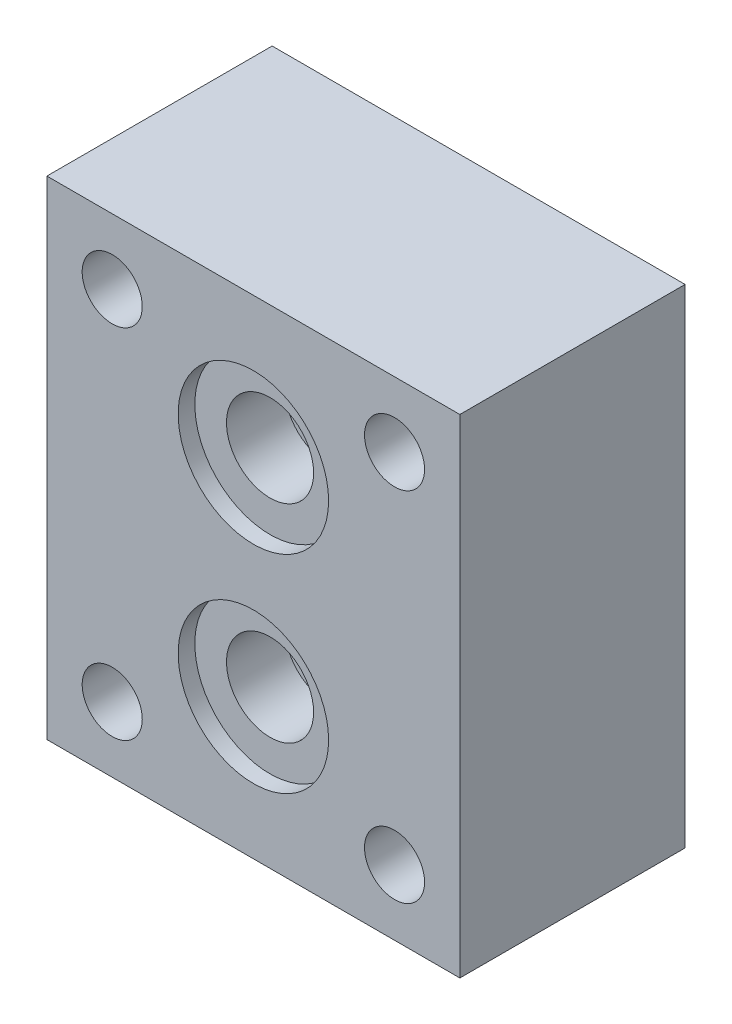
ISO-10303-21;
HEADER;
FILE_DESCRIPTION(('STEP AP214'),'2;1');
FILE_NAME('part.step','',(''),(''),'','','');
FILE_SCHEMA(('AUTOMOTIVE_DESIGN { 1 0 10303 214 1 1 1 1 }'));
ENDSEC;
DATA;
#1=APPLICATION_CONTEXT('core data for automotive mechanical design processes');
#2=APPLICATION_PROTOCOL_DEFINITION('international standard','automotive_design',2000,#1);
#3=PRODUCT_CONTEXT('',#1,'mechanical');
#4=PRODUCT('Part','Part','',(#3));
#5=PRODUCT_RELATED_PRODUCT_CATEGORY('part','',(#4));
#6=PRODUCT_DEFINITION_FORMATION('','',#4);
#7=PRODUCT_DEFINITION_CONTEXT('part definition',#1,'design');
#8=PRODUCT_DEFINITION('design','',#6,#7);
#9=PRODUCT_DEFINITION_SHAPE('','',#8);
#10=(LENGTH_UNIT() NAMED_UNIT(*) SI_UNIT(.MILLI.,.METRE.));
#11=(NAMED_UNIT(*) PLANE_ANGLE_UNIT() SI_UNIT($,.RADIAN.));
#12=(NAMED_UNIT(*) SI_UNIT($,.STERADIAN.) SOLID_ANGLE_UNIT());
#13=UNCERTAINTY_MEASURE_WITH_UNIT(LENGTH_MEASURE(1.E-05),#10,'distance_accuracy_value','');
#14=(GEOMETRIC_REPRESENTATION_CONTEXT(3) GLOBAL_UNCERTAINTY_ASSIGNED_CONTEXT((#13)) GLOBAL_UNIT_ASSIGNED_CONTEXT((#10,
#11,#12)) REPRESENTATION_CONTEXT('',''));
#15=CARTESIAN_POINT('',(0.,0.,0.));
#16=DIRECTION('',(0.,0.,1.));
#17=DIRECTION('',(1.,0.,0.));
#18=AXIS2_PLACEMENT_3D('',#15,#16,#17);
#19=CARTESIAN_POINT('',(34.925,41.275,19.05));
#20=DIRECTION('',(0.,-1.,0.));
#21=DIRECTION('',(0.,0.,-1.));
#22=AXIS2_PLACEMENT_3D('',#19,#20,#21);
#23=PLANE('',#22);
#24=DIRECTION('',(-1.,0.,0.));
#25=VECTOR('',#24,1.);
#26=CARTESIAN_POINT('',(34.925,41.275,-19.05));
#27=LINE('',#26,#25);
#28=CARTESIAN_POINT('',(34.925,41.275,-19.05));
#29=VERTEX_POINT('',#28);
#30=CARTESIAN_POINT('',(-34.925,41.275,-19.05));
#31=VERTEX_POINT('',#30);
#32=EDGE_CURVE('E109',#29,#31,#27,.T.);
#33=ORIENTED_EDGE('',*,*,#32,.T.);
#34=DIRECTION('',(0.,0.,-1.));
#35=VECTOR('',#34,1.);
#36=CARTESIAN_POINT('',(-34.925,41.275,19.05));
#37=LINE('',#36,#35);
#38=CARTESIAN_POINT('',(-34.925,41.275,19.05));
#39=VERTEX_POINT('',#38);
#40=EDGE_CURVE('E11',#39,#31,#37,.T.);
#41=ORIENTED_EDGE('',*,*,#40,.F.);
#42=DIRECTION('',(-1.,0.,0.));
#43=VECTOR('',#42,1.);
#44=CARTESIAN_POINT('',(34.925,41.275,19.05));
#45=LINE('',#44,#43);
#46=CARTESIAN_POINT('',(34.925,41.275,19.05));
#47=VERTEX_POINT('',#46);
#48=EDGE_CURVE('E96',#47,#39,#45,.T.);
#49=ORIENTED_EDGE('',*,*,#48,.F.);
#50=DIRECTION('',(0.,0.,-1.));
#51=VECTOR('',#50,1.);
#52=CARTESIAN_POINT('',(34.925,41.275,19.05));
#53=LINE('',#52,#51);
#54=EDGE_CURVE('E105',#47,#29,#53,.T.);
#55=ORIENTED_EDGE('',*,*,#54,.T.);
#56=EDGE_LOOP('',(#33,#41,#49,#55));
#57=FACE_BOUND('',#56,.T.);
#58=ADVANCED_FACE('F43',(#57),#23,.F.);
#59=CARTESIAN_POINT('',(-34.925,-41.275,19.05));
#60=DIRECTION('',(1.,0.,0.));
#61=DIRECTION('',(0.,0.,-1.));
#62=AXIS2_PLACEMENT_3D('',#59,#60,#61);
#63=PLANE('',#62);
#64=DIRECTION('',(0.,-1.,0.));
#65=VECTOR('',#64,1.);
#66=CARTESIAN_POINT('',(-34.925,-41.275,-19.05));
#67=LINE('',#66,#65);
#68=CARTESIAN_POINT('',(-34.925,-41.275,-19.05));
#69=VERTEX_POINT('',#68);
#70=EDGE_CURVE('E100',#31,#69,#67,.T.);
#71=ORIENTED_EDGE('',*,*,#70,.T.);
#72=DIRECTION('',(0.,0.,-1.));
#73=VECTOR('',#72,1.);
#74=CARTESIAN_POINT('',(-34.925,-41.275,19.05));
#75=LINE('',#74,#73);
#76=CARTESIAN_POINT('',(-34.925,-41.275,19.05));
#77=VERTEX_POINT('',#76);
#78=EDGE_CURVE('E52',#77,#69,#75,.T.);
#79=ORIENTED_EDGE('',*,*,#78,.F.);
#80=DIRECTION('',(0.,-1.,0.));
#81=VECTOR('',#80,1.);
#82=CARTESIAN_POINT('',(-34.925,-41.275,19.05));
#83=LINE('',#82,#81);
#84=EDGE_CURVE('E91',#39,#77,#83,.T.);
#85=ORIENTED_EDGE('',*,*,#84,.F.);
#86=ORIENTED_EDGE('',*,*,#40,.T.);
#87=EDGE_LOOP('',(#71,#79,#85,#86));
#88=FACE_BOUND('',#87,.T.);
#89=ADVANCED_FACE('F99',(#88),#63,.F.);
#90=CARTESIAN_POINT('',(34.925,-41.275,19.05));
#91=DIRECTION('',(0.,1.,0.));
#92=DIRECTION('',(0.,0.,1.));
#93=AXIS2_PLACEMENT_3D('',#90,#91,#92);
#94=PLANE('',#93);
#95=DIRECTION('',(1.,0.,0.));
#96=VECTOR('',#95,1.);
#97=CARTESIAN_POINT('',(34.925,-41.275,-19.05));
#98=LINE('',#97,#96);
#99=CARTESIAN_POINT('',(34.925,-41.275,-19.05));
#100=VERTEX_POINT('',#99);
#101=EDGE_CURVE('E78',#69,#100,#98,.T.);
#102=ORIENTED_EDGE('',*,*,#101,.T.);
#103=DIRECTION('',(0.,0.,-1.));
#104=VECTOR('',#103,1.);
#105=CARTESIAN_POINT('',(34.925,-41.275,19.05));
#106=LINE('',#105,#104);
#107=CARTESIAN_POINT('',(34.925,-41.275,19.05));
#108=VERTEX_POINT('',#107);
#109=EDGE_CURVE('E101',#108,#100,#106,.T.);
#110=ORIENTED_EDGE('',*,*,#109,.F.);
#111=DIRECTION('',(1.,0.,0.));
#112=VECTOR('',#111,1.);
#113=CARTESIAN_POINT('',(34.925,-41.275,19.05));
#114=LINE('',#113,#112);
#115=EDGE_CURVE('E94',#77,#108,#114,.T.);
#116=ORIENTED_EDGE('',*,*,#115,.F.);
#117=ORIENTED_EDGE('',*,*,#78,.T.);
#118=EDGE_LOOP('',(#102,#110,#116,#117));
#119=FACE_BOUND('',#118,.T.);
#120=ADVANCED_FACE('F103',(#119),#94,.F.);
#121=CARTESIAN_POINT('',(34.925,-41.275,19.05));
#122=DIRECTION('',(-1.,0.,0.));
#123=DIRECTION('',(0.,0.,1.));
#124=AXIS2_PLACEMENT_3D('',#121,#122,#123);
#125=PLANE('',#124);
#126=DIRECTION('',(0.,1.,0.));
#127=VECTOR('',#126,1.);
#128=CARTESIAN_POINT('',(34.925,-41.275,-19.05));
#129=LINE('',#128,#127);
#130=EDGE_CURVE('E84',#100,#29,#129,.T.);
#131=ORIENTED_EDGE('',*,*,#130,.T.);
#132=ORIENTED_EDGE('',*,*,#54,.F.);
#133=DIRECTION('',(0.,1.,0.));
#134=VECTOR('',#133,1.);
#135=CARTESIAN_POINT('',(34.925,-41.275,19.05));
#136=LINE('',#135,#134);
#137=EDGE_CURVE('E61',#108,#47,#136,.T.);
#138=ORIENTED_EDGE('',*,*,#137,.F.);
#139=ORIENTED_EDGE('',*,*,#109,.T.);
#140=EDGE_LOOP('',(#131,#132,#138,#139));
#141=FACE_BOUND('',#140,.T.);
#142=ADVANCED_FACE('F171',(#141),#125,.F.);
#143=CARTESIAN_POINT('',(0.,0.,19.05));
#144=DIRECTION('',(0.,0.,-1.));
#145=DIRECTION('',(-1.,0.,0.));
#146=AXIS2_PLACEMENT_3D('',#143,#144,#145);
#147=PLANE('',#146);
#148=CARTESIAN_POINT('',(0.,-17.526,19.05));
#149=DIRECTION('',(0.,0.,1.));
#150=DIRECTION('',(1.,0.,0.));
#151=AXIS2_PLACEMENT_3D('',#148,#149,#150);
#152=CIRCLE('',#151,12.7254);
#153=CARTESIAN_POINT('',(12.7254,-17.526,19.05));
#154=VERTEX_POINT('',#153);
#155=EDGE_CURVE('E125',#154,#154,#152,.T.);
#156=ORIENTED_EDGE('',*,*,#155,.F.);
#157=EDGE_LOOP('',(#156));
#158=FACE_BOUND('',#157,.T.);
#159=CARTESIAN_POINT('',(0.,17.526,19.05));
#160=DIRECTION('',(0.,0.,1.));
#161=DIRECTION('',(1.,0.,0.));
#162=AXIS2_PLACEMENT_3D('',#159,#160,#161);
#163=CIRCLE('',#162,12.7254);
#164=CARTESIAN_POINT('',(12.7254,17.526,19.05));
#165=VERTEX_POINT('',#164);
#166=EDGE_CURVE('E130',#165,#165,#163,.T.);
#167=ORIENTED_EDGE('',*,*,#166,.F.);
#168=EDGE_LOOP('',(#167));
#169=FACE_BOUND('',#168,.T.);
#170=CARTESIAN_POINT('',(23.876,30.226,19.05));
#171=DIRECTION('',(0.,0.,1.));
#172=DIRECTION('',(1.,0.,0.));
#173=AXIS2_PLACEMENT_3D('',#170,#171,#172);
#174=CIRCLE('',#173,5.08);
#175=CARTESIAN_POINT('',(28.956,30.226,19.05));
#176=VERTEX_POINT('',#175);
#177=EDGE_CURVE('E150',#176,#176,#174,.T.);
#178=ORIENTED_EDGE('',*,*,#177,.F.);
#179=EDGE_LOOP('',(#178));
#180=FACE_BOUND('',#179,.T.);
#181=CARTESIAN_POINT('',(-23.876,-30.226,19.05));
#182=DIRECTION('',(0.,0.,1.));
#183=DIRECTION('',(1.,0.,0.));
#184=AXIS2_PLACEMENT_3D('',#181,#182,#183);
#185=CIRCLE('',#184,5.08);
#186=CARTESIAN_POINT('',(-18.796,-30.226,19.05));
#187=VERTEX_POINT('',#186);
#188=EDGE_CURVE('E157',#187,#187,#185,.T.);
#189=ORIENTED_EDGE('',*,*,#188,.F.);
#190=EDGE_LOOP('',(#189));
#191=FACE_BOUND('',#190,.T.);
#192=CARTESIAN_POINT('',(-23.876,30.226,19.05));
#193=DIRECTION('',(0.,0.,1.));
#194=DIRECTION('',(1.,0.,0.));
#195=AXIS2_PLACEMENT_3D('',#192,#193,#194);
#196=CIRCLE('',#195,5.08);
#197=CARTESIAN_POINT('',(-18.796,30.226,19.05));
#198=VERTEX_POINT('',#197);
#199=EDGE_CURVE('E144',#198,#198,#196,.T.);
#200=ORIENTED_EDGE('',*,*,#199,.F.);
#201=EDGE_LOOP('',(#200));
#202=FACE_BOUND('',#201,.T.);
#203=CARTESIAN_POINT('',(23.876,-30.226,19.05));
#204=DIRECTION('',(0.,0.,1.));
#205=DIRECTION('',(1.,0.,0.));
#206=AXIS2_PLACEMENT_3D('',#203,#204,#205);
#207=CIRCLE('',#206,5.08);
#208=CARTESIAN_POINT('',(28.956,-30.226,19.05));
#209=VERTEX_POINT('',#208);
#210=EDGE_CURVE('E153',#209,#209,#207,.T.);
#211=ORIENTED_EDGE('',*,*,#210,.F.);
#212=EDGE_LOOP('',(#211));
#213=FACE_BOUND('',#212,.T.);
#214=ORIENTED_EDGE('',*,*,#48,.T.);
#215=ORIENTED_EDGE('',*,*,#84,.T.);
#216=ORIENTED_EDGE('',*,*,#115,.T.);
#217=ORIENTED_EDGE('',*,*,#137,.T.);
#218=EDGE_LOOP('',(#214,#215,#216,#217));
#219=FACE_BOUND('',#218,.T.);
#220=ADVANCED_FACE('F92',(#158,#169,#180,#191,#202,#213,#219),#147,.F.);
#221=CARTESIAN_POINT('',(0.,0.,-19.05));
#222=DIRECTION('',(0.,0.,-1.));
#223=DIRECTION('',(-1.,0.,0.));
#224=AXIS2_PLACEMENT_3D('',#221,#222,#223);
#225=PLANE('',#224);
#226=CARTESIAN_POINT('',(23.876,30.226,-19.05));
#227=DIRECTION('',(0.,0.,1.));
#228=DIRECTION('',(1.,0.,0.));
#229=AXIS2_PLACEMENT_3D('',#226,#227,#228);
#230=CIRCLE('',#229,5.08);
#231=CARTESIAN_POINT('',(28.956,30.226,-19.05));
#232=VERTEX_POINT('',#231);
#233=EDGE_CURVE('E154',#232,#232,#230,.T.);
#234=ORIENTED_EDGE('',*,*,#233,.T.);
#235=EDGE_LOOP('',(#234));
#236=FACE_BOUND('',#235,.T.);
#237=CARTESIAN_POINT('',(-23.876,-30.226,-19.05));
#238=DIRECTION('',(0.,0.,1.));
#239=DIRECTION('',(1.,0.,0.));
#240=AXIS2_PLACEMENT_3D('',#237,#238,#239);
#241=CIRCLE('',#240,5.08);
#242=CARTESIAN_POINT('',(-18.796,-30.226,-19.05));
#243=VERTEX_POINT('',#242);
#244=EDGE_CURVE('E147',#243,#243,#241,.T.);
#245=ORIENTED_EDGE('',*,*,#244,.T.);
#246=EDGE_LOOP('',(#245));
#247=FACE_BOUND('',#246,.T.);
#248=CARTESIAN_POINT('',(-23.876,30.226,-19.05));
#249=DIRECTION('',(0.,0.,1.));
#250=DIRECTION('',(1.,0.,0.));
#251=AXIS2_PLACEMENT_3D('',#248,#249,#250);
#252=CIRCLE('',#251,5.08);
#253=CARTESIAN_POINT('',(-18.796,30.226,-19.05));
#254=VERTEX_POINT('',#253);
#255=EDGE_CURVE('E141',#254,#254,#252,.T.);
#256=ORIENTED_EDGE('',*,*,#255,.T.);
#257=EDGE_LOOP('',(#256));
#258=FACE_BOUND('',#257,.T.);
#259=CARTESIAN_POINT('',(23.876,-30.226,-19.05));
#260=DIRECTION('',(0.,0.,1.));
#261=DIRECTION('',(1.,0.,0.));
#262=AXIS2_PLACEMENT_3D('',#259,#260,#261);
#263=CIRCLE('',#262,5.08);
#264=CARTESIAN_POINT('',(28.956,-30.226,-19.05));
#265=VERTEX_POINT('',#264);
#266=EDGE_CURVE('E112',#265,#265,#263,.T.);
#267=ORIENTED_EDGE('',*,*,#266,.T.);
#268=EDGE_LOOP('',(#267));
#269=FACE_BOUND('',#268,.T.);
#270=ORIENTED_EDGE('',*,*,#32,.F.);
#271=ORIENTED_EDGE('',*,*,#130,.F.);
#272=ORIENTED_EDGE('',*,*,#101,.F.);
#273=ORIENTED_EDGE('',*,*,#70,.F.);
#274=EDGE_LOOP('',(#270,#271,#272,#273));
#275=FACE_BOUND('',#274,.T.);
#276=ADVANCED_FACE('F170',(#236,#247,#258,#269,#275),#225,.T.);
#277=CARTESIAN_POINT('',(23.876,-30.226,-19.05));
#278=DIRECTION('',(0.,0.,1.));
#279=DIRECTION('',(1.,0.,0.));
#280=AXIS2_PLACEMENT_3D('',#277,#278,#279);
#281=CYLINDRICAL_SURFACE('',#280,5.08);
#282=ORIENTED_EDGE('',*,*,#266,.F.);
#283=EDGE_LOOP('',(#282));
#284=FACE_BOUND('',#283,.T.);
#285=ORIENTED_EDGE('',*,*,#210,.T.);
#286=EDGE_LOOP('',(#285));
#287=FACE_BOUND('',#286,.T.);
#288=ADVANCED_FACE('F167',(#284,#287),#281,.F.);
#289=CARTESIAN_POINT('',(-23.876,30.226,-19.05));
#290=DIRECTION('',(0.,0.,1.));
#291=DIRECTION('',(1.,0.,0.));
#292=AXIS2_PLACEMENT_3D('',#289,#290,#291);
#293=CYLINDRICAL_SURFACE('',#292,5.08);
#294=ORIENTED_EDGE('',*,*,#255,.F.);
#295=EDGE_LOOP('',(#294));
#296=FACE_BOUND('',#295,.T.);
#297=ORIENTED_EDGE('',*,*,#199,.T.);
#298=EDGE_LOOP('',(#297));
#299=FACE_BOUND('',#298,.T.);
#300=ADVANCED_FACE('F216',(#296,#299),#293,.F.);
#301=CARTESIAN_POINT('',(-23.876,-30.226,-19.05));
#302=DIRECTION('',(0.,0.,1.));
#303=DIRECTION('',(1.,0.,0.));
#304=AXIS2_PLACEMENT_3D('',#301,#302,#303);
#305=CYLINDRICAL_SURFACE('',#304,5.08);
#306=ORIENTED_EDGE('',*,*,#244,.F.);
#307=EDGE_LOOP('',(#306));
#308=FACE_BOUND('',#307,.T.);
#309=ORIENTED_EDGE('',*,*,#188,.T.);
#310=EDGE_LOOP('',(#309));
#311=FACE_BOUND('',#310,.T.);
#312=ADVANCED_FACE('F224',(#308,#311),#305,.F.);
#313=CARTESIAN_POINT('',(23.876,30.226,-19.05));
#314=DIRECTION('',(0.,0.,1.));
#315=DIRECTION('',(1.,0.,0.));
#316=AXIS2_PLACEMENT_3D('',#313,#314,#315);
#317=CYLINDRICAL_SURFACE('',#316,5.08);
#318=ORIENTED_EDGE('',*,*,#233,.F.);
#319=EDGE_LOOP('',(#318));
#320=FACE_BOUND('',#319,.T.);
#321=ORIENTED_EDGE('',*,*,#177,.T.);
#322=EDGE_LOOP('',(#321));
#323=FACE_BOUND('',#322,.T.);
#324=ADVANCED_FACE('F233',(#320,#323),#317,.F.);
#325=CARTESIAN_POINT('',(0.,-17.526,16.2306));
#326=DIRECTION('',(0.,0.,1.));
#327=DIRECTION('',(1.,0.,0.));
#328=AXIS2_PLACEMENT_3D('',#325,#326,#327);
#329=PLANE('',#328);
#330=CARTESIAN_POINT('',(0.,-17.526,16.2306));
#331=DIRECTION('',(0.,0.,1.));
#332=DIRECTION('',(1.,0.,0.));
#333=AXIS2_PLACEMENT_3D('',#330,#331,#332);
#334=CIRCLE('',#333,12.7254);
#335=CARTESIAN_POINT('',(12.7254,-17.526,16.2306));
#336=VERTEX_POINT('',#335);
#337=EDGE_CURVE('E119',#336,#336,#334,.T.);
#338=ORIENTED_EDGE('',*,*,#337,.T.);
#339=EDGE_LOOP('',(#338));
#340=FACE_BOUND('',#339,.T.);
#341=CARTESIAN_POINT('',(0.,-17.526,16.2306));
#342=DIRECTION('',(0.,0.,1.));
#343=DIRECTION('',(1.,0.,0.));
#344=AXIS2_PLACEMENT_3D('',#341,#342,#343);
#345=CIRCLE('',#344,7.366);
#346=CARTESIAN_POINT('',(7.366,-17.526,16.2306));
#347=VERTEX_POINT('',#346);
#348=EDGE_CURVE('E117',#347,#347,#345,.F.);
#349=ORIENTED_EDGE('',*,*,#348,.T.);
#350=EDGE_LOOP('',(#349));
#351=FACE_BOUND('',#350,.T.);
#352=ADVANCED_FACE('F242',(#340,#351),#329,.T.);
#353=CARTESIAN_POINT('',(0.,-17.526,16.2306));
#354=DIRECTION('',(0.,0.,1.));
#355=DIRECTION('',(1.,0.,0.));
#356=AXIS2_PLACEMENT_3D('',#353,#354,#355);
#357=CYLINDRICAL_SURFACE('',#356,12.7254);
#358=ORIENTED_EDGE('',*,*,#337,.F.);
#359=EDGE_LOOP('',(#358));
#360=FACE_BOUND('',#359,.T.);
#361=ORIENTED_EDGE('',*,*,#155,.T.);
#362=EDGE_LOOP('',(#361));
#363=FACE_BOUND('',#362,.T.);
#364=ADVANCED_FACE('F289',(#360,#363),#357,.F.);
#365=CARTESIAN_POINT('',(0.,17.526,16.2306));
#366=DIRECTION('',(0.,0.,1.));
#367=DIRECTION('',(1.,0.,0.));
#368=AXIS2_PLACEMENT_3D('',#365,#366,#367);
#369=PLANE('',#368);
#370=CARTESIAN_POINT('',(0.,17.526,16.2306));
#371=DIRECTION('',(0.,0.,1.));
#372=DIRECTION('',(1.,0.,0.));
#373=AXIS2_PLACEMENT_3D('',#370,#371,#372);
#374=CIRCLE('',#373,12.7254);
#375=CARTESIAN_POINT('',(12.7254,17.526,16.2306));
#376=VERTEX_POINT('',#375);
#377=EDGE_CURVE('E135',#376,#376,#374,.T.);
#378=ORIENTED_EDGE('',*,*,#377,.T.);
#379=EDGE_LOOP('',(#378));
#380=FACE_BOUND('',#379,.T.);
#381=CARTESIAN_POINT('',(0.,17.526,16.2306));
#382=DIRECTION('',(0.,0.,1.));
#383=DIRECTION('',(1.,0.,0.));
#384=AXIS2_PLACEMENT_3D('',#381,#382,#383);
#385=CIRCLE('',#384,7.366);
#386=CARTESIAN_POINT('',(7.366,17.526,16.2306));
#387=VERTEX_POINT('',#386);
#388=EDGE_CURVE('E46',#387,#387,#385,.F.);
#389=ORIENTED_EDGE('',*,*,#388,.T.);
#390=EDGE_LOOP('',(#389));
#391=FACE_BOUND('',#390,.T.);
#392=ADVANCED_FACE('F298',(#380,#391),#369,.T.);
#393=CARTESIAN_POINT('',(0.,17.526,16.2306));
#394=DIRECTION('',(0.,0.,1.));
#395=DIRECTION('',(1.,0.,0.));
#396=AXIS2_PLACEMENT_3D('',#393,#394,#395);
#397=CYLINDRICAL_SURFACE('',#396,12.7254);
#398=ORIENTED_EDGE('',*,*,#377,.F.);
#399=EDGE_LOOP('',(#398));
#400=FACE_BOUND('',#399,.T.);
#401=ORIENTED_EDGE('',*,*,#166,.T.);
#402=EDGE_LOOP('',(#401));
#403=FACE_BOUND('',#402,.T.);
#404=ADVANCED_FACE('F261',(#400,#403),#397,.F.);
#405=CARTESIAN_POINT('',(0.,-17.526,6.35));
#406=DIRECTION('',(0.,0.,1.));
#407=DIRECTION('',(1.,0.,0.));
#408=AXIS2_PLACEMENT_3D('',#405,#406,#407);
#409=PLANE('',#408);
#410=CARTESIAN_POINT('',(0.,-17.526,6.35));
#411=DIRECTION('',(0.,0.,1.));
#412=DIRECTION('',(1.,0.,0.));
#413=AXIS2_PLACEMENT_3D('',#410,#411,#412);
#414=CIRCLE('',#413,7.366);
#415=CARTESIAN_POINT('',(7.366,-17.526,6.35));
#416=VERTEX_POINT('',#415);
#417=EDGE_CURVE('E138',#416,#416,#414,.T.);
#418=ORIENTED_EDGE('',*,*,#417,.T.);
#419=EDGE_LOOP('',(#418));
#420=FACE_BOUND('',#419,.T.);
#421=ADVANCED_FACE('F259',(#420),#409,.T.);
#422=CARTESIAN_POINT('',(0.,-17.526,6.35));
#423=DIRECTION('',(0.,0.,1.));
#424=DIRECTION('',(1.,0.,0.));
#425=AXIS2_PLACEMENT_3D('',#422,#423,#424);
#426=CYLINDRICAL_SURFACE('',#425,7.366);
#427=ORIENTED_EDGE('',*,*,#417,.F.);
#428=EDGE_LOOP('',(#427));
#429=FACE_BOUND('',#428,.T.);
#430=ORIENTED_EDGE('',*,*,#348,.F.);
#431=EDGE_LOOP('',(#430));
#432=FACE_BOUND('',#431,.T.);
#433=ADVANCED_FACE('F252',(#429,#432),#426,.F.);
#434=CARTESIAN_POINT('',(0.,17.526,6.35));
#435=DIRECTION('',(0.,0.,1.));
#436=DIRECTION('',(1.,0.,0.));
#437=AXIS2_PLACEMENT_3D('',#434,#435,#436);
#438=PLANE('',#437);
#439=CARTESIAN_POINT('',(0.,17.526,6.35));
#440=DIRECTION('',(0.,0.,1.));
#441=DIRECTION('',(1.,0.,0.));
#442=AXIS2_PLACEMENT_3D('',#439,#440,#441);
#443=CIRCLE('',#442,7.366);
#444=CARTESIAN_POINT('',(7.366,17.526,6.35));
#445=VERTEX_POINT('',#444);
#446=EDGE_CURVE('E123',#445,#445,#443,.T.);
#447=ORIENTED_EDGE('',*,*,#446,.T.);
#448=EDGE_LOOP('',(#447));
#449=FACE_BOUND('',#448,.T.);
#450=ADVANCED_FACE('F249',(#449),#438,.T.);
#451=CARTESIAN_POINT('',(0.,17.526,6.35));
#452=DIRECTION('',(0.,0.,1.));
#453=DIRECTION('',(1.,0.,0.));
#454=AXIS2_PLACEMENT_3D('',#451,#452,#453);
#455=CYLINDRICAL_SURFACE('',#454,7.366);
#456=ORIENTED_EDGE('',*,*,#446,.F.);
#457=EDGE_LOOP('',(#456));
#458=FACE_BOUND('',#457,.T.);
#459=ORIENTED_EDGE('',*,*,#388,.F.);
#460=EDGE_LOOP('',(#459));
#461=FACE_BOUND('',#460,.T.);
#462=ADVANCED_FACE('F251',(#458,#461),#455,.F.);
#463=CLOSED_SHELL('',(#58,#89,#120,#142,#220,#276,#288,#300,#312,#324,#352,#364,#392,#404,#421,
#433,#450,#462));
#464=MANIFOLD_SOLID_BREP('B2',#463);
#465=ADVANCED_BREP_SHAPE_REPRESENTATION('',(#18,#464),#14);
#466=SHAPE_DEFINITION_REPRESENTATION(#9,#465);
ENDSEC;
END-ISO-10303-21;
